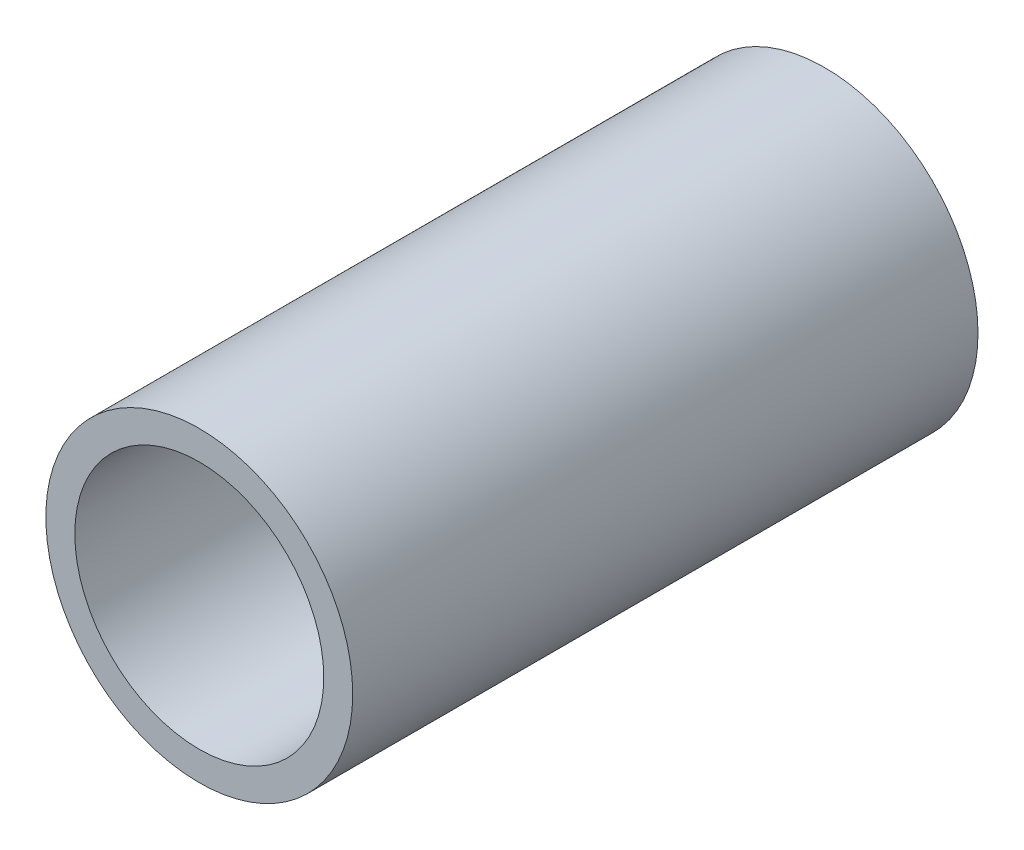
ISO-10303-21;
HEADER;
FILE_DESCRIPTION(('STEP AP214'),'2;1');
FILE_NAME('part.step','',(''),(''),'','','');
FILE_SCHEMA(('AUTOMOTIVE_DESIGN { 1 0 10303 214 1 1 1 1 }'));
ENDSEC;
DATA;
#1=APPLICATION_CONTEXT('core data for automotive mechanical design processes');
#2=APPLICATION_PROTOCOL_DEFINITION('international standard','automotive_design',2000,#1);
#3=PRODUCT_CONTEXT('',#1,'mechanical');
#4=PRODUCT('Part','Part','',(#3));
#5=PRODUCT_RELATED_PRODUCT_CATEGORY('part','',(#4));
#6=PRODUCT_DEFINITION_FORMATION('','',#4);
#7=PRODUCT_DEFINITION_CONTEXT('part definition',#1,'design');
#8=PRODUCT_DEFINITION('design','',#6,#7);
#9=PRODUCT_DEFINITION_SHAPE('','',#8);
#10=(LENGTH_UNIT() NAMED_UNIT(*) SI_UNIT(.MILLI.,.METRE.));
#11=(NAMED_UNIT(*) PLANE_ANGLE_UNIT() SI_UNIT($,.RADIAN.));
#12=(NAMED_UNIT(*) SI_UNIT($,.STERADIAN.) SOLID_ANGLE_UNIT());
#13=UNCERTAINTY_MEASURE_WITH_UNIT(LENGTH_MEASURE(1.E-05),#10,'distance_accuracy_value','');
#14=(GEOMETRIC_REPRESENTATION_CONTEXT(3) GLOBAL_UNCERTAINTY_ASSIGNED_CONTEXT((#13)) GLOBAL_UNIT_ASSIGNED_CONTEXT((#10,
#11,#12)) REPRESENTATION_CONTEXT('',''));
#15=CARTESIAN_POINT('',(0.,0.,0.));
#16=DIRECTION('',(0.,0.,1.));
#17=DIRECTION('',(1.,0.,0.));
#18=AXIS2_PLACEMENT_3D('',#15,#16,#17);
#19=CARTESIAN_POINT('',(0.,0.,108.));
#20=DIRECTION('',(0.,0.,1.));
#21=DIRECTION('',(1.,0.,0.));
#22=AXIS2_PLACEMENT_3D('',#19,#20,#21);
#23=PLANE('',#22);
#24=CARTESIAN_POINT('',(0.,0.,108.));
#25=DIRECTION('',(0.,0.,1.));
#26=DIRECTION('',(1.,0.,0.));
#27=AXIS2_PLACEMENT_3D('',#24,#25,#26);
#28=CIRCLE('',#27,26.5);
#29=CARTESIAN_POINT('',(26.5,0.,108.));
#30=VERTEX_POINT('',#29);
#31=EDGE_CURVE('E10',#30,#30,#28,.T.);
#32=ORIENTED_EDGE('',*,*,#31,.T.);
#33=EDGE_LOOP('',(#32));
#34=FACE_BOUND('',#33,.T.);
#35=CARTESIAN_POINT('',(0.,0.,108.));
#36=DIRECTION('',(0.,0.,1.));
#37=DIRECTION('',(1.,0.,0.));
#38=AXIS2_PLACEMENT_3D('',#35,#36,#37);
#39=CIRCLE('',#38,21.5);
#40=CARTESIAN_POINT('',(21.5,0.,108.));
#41=VERTEX_POINT('',#40);
#42=EDGE_CURVE('E43',#41,#41,#39,.T.);
#43=ORIENTED_EDGE('',*,*,#42,.F.);
#44=EDGE_LOOP('',(#43));
#45=FACE_BOUND('',#44,.T.);
#46=ADVANCED_FACE('F32',(#34,#45),#23,.T.);
#47=CARTESIAN_POINT('',(0.,0.,0.));
#48=DIRECTION('',(0.,0.,1.));
#49=DIRECTION('',(1.,0.,0.));
#50=AXIS2_PLACEMENT_3D('',#47,#48,#49);
#51=PLANE('',#50);
#52=CARTESIAN_POINT('',(0.,0.,0.));
#53=DIRECTION('',(0.,0.,1.));
#54=DIRECTION('',(1.,0.,0.));
#55=AXIS2_PLACEMENT_3D('',#52,#53,#54);
#56=CIRCLE('',#55,26.5);
#57=CARTESIAN_POINT('',(26.5,0.,0.));
#58=VERTEX_POINT('',#57);
#59=EDGE_CURVE('E36',#58,#58,#56,.T.);
#60=ORIENTED_EDGE('',*,*,#59,.F.);
#61=EDGE_LOOP('',(#60));
#62=FACE_BOUND('',#61,.T.);
#63=CARTESIAN_POINT('',(0.,0.,0.));
#64=DIRECTION('',(0.,0.,1.));
#65=DIRECTION('',(1.,0.,0.));
#66=AXIS2_PLACEMENT_3D('',#63,#64,#65);
#67=CIRCLE('',#66,21.5);
#68=CARTESIAN_POINT('',(21.5,0.,0.));
#69=VERTEX_POINT('',#68);
#70=EDGE_CURVE('E45',#69,#69,#67,.T.);
#71=ORIENTED_EDGE('',*,*,#70,.T.);
#72=EDGE_LOOP('',(#71));
#73=FACE_BOUND('',#72,.T.);
#74=ADVANCED_FACE('F55',(#62,#73),#51,.F.);
#75=CARTESIAN_POINT('',(0.,0.,108.));
#76=DIRECTION('',(0.,0.,-1.));
#77=DIRECTION('',(-1.,0.,0.));
#78=AXIS2_PLACEMENT_3D('',#75,#76,#77);
#79=CYLINDRICAL_SURFACE('',#78,26.5);
#80=ORIENTED_EDGE('',*,*,#31,.F.);
#81=EDGE_LOOP('',(#80));
#82=FACE_BOUND('',#81,.T.);
#83=ORIENTED_EDGE('',*,*,#59,.T.);
#84=EDGE_LOOP('',(#83));
#85=FACE_BOUND('',#84,.T.);
#86=ADVANCED_FACE('F34',(#82,#85),#79,.T.);
#87=CARTESIAN_POINT('',(0.,0.,108.));
#88=DIRECTION('',(0.,0.,-1.));
#89=DIRECTION('',(-1.,0.,0.));
#90=AXIS2_PLACEMENT_3D('',#87,#88,#89);
#91=CYLINDRICAL_SURFACE('',#90,21.5);
#92=ORIENTED_EDGE('',*,*,#42,.T.);
#93=EDGE_LOOP('',(#92));
#94=FACE_BOUND('',#93,.T.);
#95=ORIENTED_EDGE('',*,*,#70,.F.);
#96=EDGE_LOOP('',(#95));
#97=FACE_BOUND('',#96,.T.);
#98=ADVANCED_FACE('F51',(#94,#97),#91,.F.);
#99=CLOSED_SHELL('',(#46,#74,#86,#98));
#100=MANIFOLD_SOLID_BREP('B2',#99);
#101=ADVANCED_BREP_SHAPE_REPRESENTATION('',(#18,#100),#14);
#102=SHAPE_DEFINITION_REPRESENTATION(#9,#101);
ENDSEC;
END-ISO-10303-21;
